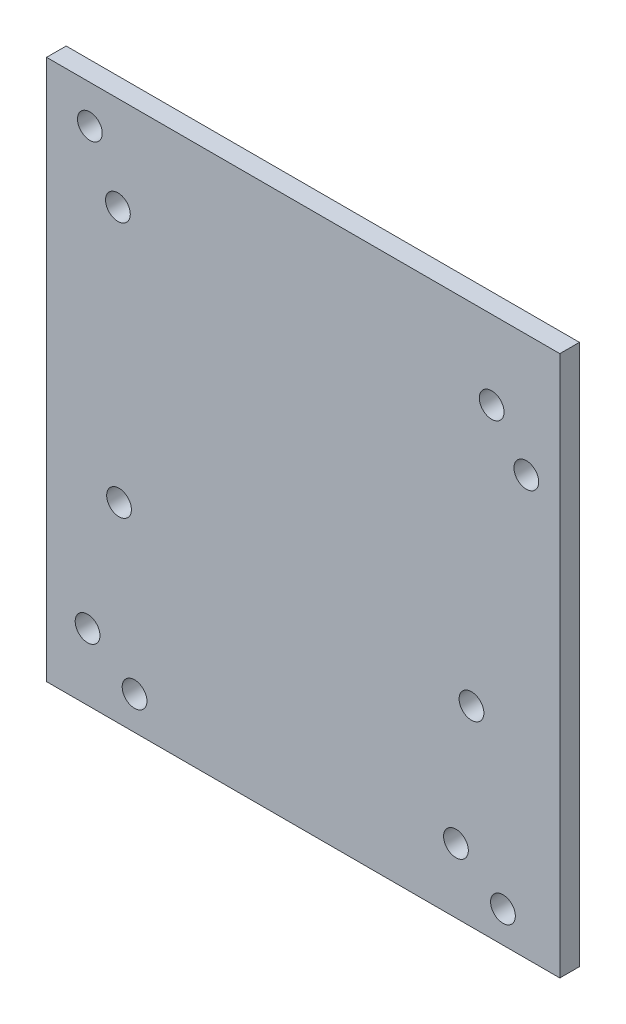
ISO-10303-21;
HEADER;
FILE_DESCRIPTION(('STEP AP214'),'2;1');
FILE_NAME('part.step','',(''),(''),'','','');
FILE_SCHEMA(('AUTOMOTIVE_DESIGN { 1 0 10303 214 1 1 1 1 }'));
ENDSEC;
DATA;
#1=APPLICATION_CONTEXT('core data for automotive mechanical design processes');
#2=APPLICATION_PROTOCOL_DEFINITION('international standard','automotive_design',2000,#1);
#3=PRODUCT_CONTEXT('',#1,'mechanical');
#4=PRODUCT('Part','Part','',(#3));
#5=PRODUCT_RELATED_PRODUCT_CATEGORY('part','',(#4));
#6=PRODUCT_DEFINITION_FORMATION('','',#4);
#7=PRODUCT_DEFINITION_CONTEXT('part definition',#1,'design');
#8=PRODUCT_DEFINITION('design','',#6,#7);
#9=PRODUCT_DEFINITION_SHAPE('','',#8);
#10=(LENGTH_UNIT() NAMED_UNIT(*) SI_UNIT(.MILLI.,.METRE.));
#11=(NAMED_UNIT(*) PLANE_ANGLE_UNIT() SI_UNIT($,.RADIAN.));
#12=(NAMED_UNIT(*) SI_UNIT($,.STERADIAN.) SOLID_ANGLE_UNIT());
#13=UNCERTAINTY_MEASURE_WITH_UNIT(LENGTH_MEASURE(1.E-05),#10,'distance_accuracy_value','');
#14=(GEOMETRIC_REPRESENTATION_CONTEXT(3) GLOBAL_UNCERTAINTY_ASSIGNED_CONTEXT((#13)) GLOBAL_UNIT_ASSIGNED_CONTEXT((#10,
#11,#12)) REPRESENTATION_CONTEXT('',''));
#15=CARTESIAN_POINT('',(0.,0.,0.));
#16=DIRECTION('',(0.,0.,1.));
#17=DIRECTION('',(1.,0.,0.));
#18=AXIS2_PLACEMENT_3D('',#15,#16,#17);
#19=CARTESIAN_POINT('',(0.,0.,-6.35));
#20=DIRECTION('',(0.,0.,1.));
#21=DIRECTION('',(-1.,0.,0.));
#22=AXIS2_PLACEMENT_3D('',#19,#20,#21);
#23=PLANE('',#22);
#24=DIRECTION('',(0.,1.,0.));
#25=VECTOR('',#24,1.);
#26=CARTESIAN_POINT('',(-529.711216697131,207.903265585856,-6.35));
#27=LINE('',#26,#25);
#28=CARTESIAN_POINT('',(-529.711216697131,207.903265585856,-6.35));
#29=VERTEX_POINT('',#28);
#30=CARTESIAN_POINT('',(-529.711216697131,383.2533201506,-6.35));
#31=VERTEX_POINT('',#30);
#32=EDGE_CURVE('E97',#29,#31,#27,.T.);
#33=ORIENTED_EDGE('',*,*,#32,.F.);
#34=DIRECTION('',(1.,0.,0.));
#35=VECTOR('',#34,1.);
#36=CARTESIAN_POINT('',(-696.157504886553,207.903265585856,-6.35));
#37=LINE('',#36,#35);
#38=CARTESIAN_POINT('',(-696.157504886553,207.903265585856,-6.35));
#39=VERTEX_POINT('',#38);
#40=EDGE_CURVE('E100',#39,#29,#37,.T.);
#41=ORIENTED_EDGE('',*,*,#40,.F.);
#42=DIRECTION('',(0.,-1.,0.));
#43=VECTOR('',#42,1.);
#44=CARTESIAN_POINT('',(-696.157504886553,207.903265585856,-6.35));
#45=LINE('',#44,#43);
#46=CARTESIAN_POINT('',(-696.157504886553,383.2533201506,-6.35));
#47=VERTEX_POINT('',#46);
#48=EDGE_CURVE('E88',#47,#39,#45,.T.);
#49=ORIENTED_EDGE('',*,*,#48,.F.);
#50=DIRECTION('',(-1.,0.,0.));
#51=VECTOR('',#50,1.);
#52=CARTESIAN_POINT('',(-696.157504886553,383.2533201506,-6.35));
#53=LINE('',#52,#51);
#54=EDGE_CURVE('E93',#31,#47,#53,.T.);
#55=ORIENTED_EDGE('',*,*,#54,.F.);
#56=EDGE_LOOP('',(#33,#41,#49,#55));
#57=FACE_BOUND('',#56,.T.);
#58=CARTESIAN_POINT('',(-667.625800723058,218.698265585856,-6.35));
#59=DIRECTION('',(0.,0.,1.));
#60=DIRECTION('',(1.,0.,0.));
#61=AXIS2_PLACEMENT_3D('',#58,#59,#60);
#62=CIRCLE('',#61,4.01269999999997);
#63=CARTESIAN_POINT('',(-663.613100723058,218.698265585856,-6.35));
#64=VERTEX_POINT('',#63);
#65=EDGE_CURVE('E109',#64,#64,#62,.T.);
#66=ORIENTED_EDGE('',*,*,#65,.T.);
#67=EDGE_LOOP('',(#66));
#68=FACE_BOUND('',#67,.T.);
#69=CARTESIAN_POINT('',(-682.865800723058,229.493265585856,-6.35));
#70=DIRECTION('',(0.,0.,1.));
#71=DIRECTION('',(1.,0.,0.));
#72=AXIS2_PLACEMENT_3D('',#69,#70,#71);
#73=CIRCLE('',#72,4.01269999999997);
#74=CARTESIAN_POINT('',(-678.853100723058,229.493265585856,-6.35));
#75=VERTEX_POINT('',#74);
#76=EDGE_CURVE('E120',#75,#75,#73,.T.);
#77=ORIENTED_EDGE('',*,*,#76,.T.);
#78=EDGE_LOOP('',(#77));
#79=FACE_BOUND('',#78,.T.);
#80=CARTESIAN_POINT('',(-682.121778023771,370.932816424034,-6.35));
#81=DIRECTION('',(0.,0.,1.));
#82=DIRECTION('',(1.,0.,0.));
#83=AXIS2_PLACEMENT_3D('',#80,#81,#82);
#84=CIRCLE('',#83,4.01270000000008);
#85=CARTESIAN_POINT('',(-678.109078023771,370.932816424034,-6.35));
#86=VERTEX_POINT('',#85);
#87=EDGE_CURVE('E126',#86,#86,#84,.T.);
#88=ORIENTED_EDGE('',*,*,#87,.T.);
#89=EDGE_LOOP('',(#88));
#90=FACE_BOUND('',#89,.T.);
#91=CARTESIAN_POINT('',(-673.025414387742,352.751458014907,-6.35));
#92=DIRECTION('',(0.,0.,1.));
#93=DIRECTION('',(1.,0.,0.));
#94=AXIS2_PLACEMENT_3D('',#91,#92,#93);
#95=CIRCLE('',#94,4.01270000000008);
#96=CARTESIAN_POINT('',(-669.012714387742,352.751458014907,-6.35));
#97=VERTEX_POINT('',#96);
#98=EDGE_CURVE('E132',#97,#97,#95,.T.);
#99=ORIENTED_EDGE('',*,*,#98,.T.);
#100=EDGE_LOOP('',(#99));
#101=FACE_BOUND('',#100,.T.);
#102=CARTESIAN_POINT('',(-551.816021725944,357.766762234083,-6.35));
#103=DIRECTION('',(0.,0.,1.));
#104=DIRECTION('',(1.,0.,0.));
#105=AXIS2_PLACEMENT_3D('',#102,#103,#104);
#106=CIRCLE('',#105,4.01270000000008);
#107=CARTESIAN_POINT('',(-547.803321725944,357.766762234083,-6.35));
#108=VERTEX_POINT('',#107);
#109=EDGE_CURVE('E138',#108,#108,#106,.T.);
#110=ORIENTED_EDGE('',*,*,#109,.T.);
#111=EDGE_LOOP('',(#110));
#112=FACE_BOUND('',#111,.T.);
#113=CARTESIAN_POINT('',(-540.572963717979,343.760561941729,-6.35));
#114=DIRECTION('',(0.,0.,1.));
#115=DIRECTION('',(1.,0.,0.));
#116=AXIS2_PLACEMENT_3D('',#113,#114,#115);
#117=CIRCLE('',#116,4.01270000000008);
#118=CARTESIAN_POINT('',(-536.560263717979,343.760561941729,-6.35));
#119=VERTEX_POINT('',#118);
#120=EDGE_CURVE('E144',#119,#119,#117,.T.);
#121=ORIENTED_EDGE('',*,*,#120,.T.);
#122=EDGE_LOOP('',(#121));
#123=FACE_BOUND('',#122,.T.);
#124=CARTESIAN_POINT('',(-548.156926739575,218.063265585856,-6.35));
#125=DIRECTION('',(0.,0.,1.));
#126=DIRECTION('',(1.,0.,0.));
#127=AXIS2_PLACEMENT_3D('',#124,#125,#126);
#128=CIRCLE('',#127,4.01270000000008);
#129=CARTESIAN_POINT('',(-544.144226739575,218.063265585856,-6.35));
#130=VERTEX_POINT('',#129);
#131=EDGE_CURVE('E150',#130,#130,#128,.T.);
#132=ORIENTED_EDGE('',*,*,#131,.T.);
#133=EDGE_LOOP('',(#132));
#134=FACE_BOUND('',#133,.T.);
#135=CARTESIAN_POINT('',(-563.396926739575,228.858265585856,-6.35));
#136=DIRECTION('',(0.,0.,1.));
#137=DIRECTION('',(1.,0.,0.));
#138=AXIS2_PLACEMENT_3D('',#135,#136,#137);
#139=CIRCLE('',#138,4.01270000000008);
#140=CARTESIAN_POINT('',(-559.384226739575,228.858265585856,-6.35));
#141=VERTEX_POINT('',#140);
#142=EDGE_CURVE('E156',#141,#141,#139,.T.);
#143=ORIENTED_EDGE('',*,*,#142,.T.);
#144=EDGE_LOOP('',(#143));
#145=FACE_BOUND('',#144,.T.);
#146=CARTESIAN_POINT('',(-558.361573731319,269.97258035059,-6.35));
#147=DIRECTION('',(0.,0.,1.));
#148=DIRECTION('',(1.,0.,0.));
#149=AXIS2_PLACEMENT_3D('',#146,#147,#148);
#150=CIRCLE('',#149,4.01320000000002);
#151=CARTESIAN_POINT('',(-554.348373731319,269.97258035059,-6.35));
#152=VERTEX_POINT('',#151);
#153=EDGE_CURVE('E162',#152,#152,#150,.T.);
#154=ORIENTED_EDGE('',*,*,#153,.T.);
#155=EDGE_LOOP('',(#154));
#156=FACE_BOUND('',#155,.T.);
#157=CARTESIAN_POINT('',(-672.661153731319,269.972580350589,-6.35));
#158=DIRECTION('',(0.,0.,1.));
#159=DIRECTION('',(1.,0.,0.));
#160=AXIS2_PLACEMENT_3D('',#157,#158,#159);
#161=CIRCLE('',#160,4.01320000000002);
#162=CARTESIAN_POINT('',(-668.647953731319,269.972580350589,-6.35));
#163=VERTEX_POINT('',#162);
#164=EDGE_CURVE('E168',#163,#163,#161,.T.);
#165=ORIENTED_EDGE('',*,*,#164,.T.);
#166=EDGE_LOOP('',(#165));
#167=FACE_BOUND('',#166,.T.);
#168=ADVANCED_FACE('F41',(#57,#68,#79,#90,#101,#112,#123,#134,#145,#156,#167),#23,.F.);
#169=CARTESIAN_POINT('',(0.,0.,0.));
#170=DIRECTION('',(0.,0.,1.));
#171=DIRECTION('',(-1.,0.,0.));
#172=AXIS2_PLACEMENT_3D('',#169,#170,#171);
#173=PLANE('',#172);
#174=CARTESIAN_POINT('',(-558.361573731319,269.97258035059,0.));
#175=DIRECTION('',(0.,0.,1.));
#176=DIRECTION('',(1.,0.,0.));
#177=AXIS2_PLACEMENT_3D('',#174,#175,#176);
#178=CIRCLE('',#177,4.01320000000002);
#179=CARTESIAN_POINT('',(-554.348373731319,269.97258035059,0.));
#180=VERTEX_POINT('',#179);
#181=EDGE_CURVE('E165',#180,#180,#178,.T.);
#182=ORIENTED_EDGE('',*,*,#181,.F.);
#183=EDGE_LOOP('',(#182));
#184=FACE_BOUND('',#183,.T.);
#185=CARTESIAN_POINT('',(-548.156926739575,218.063265585856,0.));
#186=DIRECTION('',(0.,0.,1.));
#187=DIRECTION('',(1.,0.,0.));
#188=AXIS2_PLACEMENT_3D('',#185,#186,#187);
#189=CIRCLE('',#188,4.01270000000008);
#190=CARTESIAN_POINT('',(-544.144226739575,218.063265585856,0.));
#191=VERTEX_POINT('',#190);
#192=EDGE_CURVE('E153',#191,#191,#189,.T.);
#193=ORIENTED_EDGE('',*,*,#192,.F.);
#194=EDGE_LOOP('',(#193));
#195=FACE_BOUND('',#194,.T.);
#196=CARTESIAN_POINT('',(-551.816021725944,357.766762234083,0.));
#197=DIRECTION('',(0.,0.,1.));
#198=DIRECTION('',(1.,0.,0.));
#199=AXIS2_PLACEMENT_3D('',#196,#197,#198);
#200=CIRCLE('',#199,4.01270000000008);
#201=CARTESIAN_POINT('',(-547.803321725944,357.766762234083,0.));
#202=VERTEX_POINT('',#201);
#203=EDGE_CURVE('E141',#202,#202,#200,.T.);
#204=ORIENTED_EDGE('',*,*,#203,.F.);
#205=EDGE_LOOP('',(#204));
#206=FACE_BOUND('',#205,.T.);
#207=CARTESIAN_POINT('',(-682.121778023771,370.932816424034,0.));
#208=DIRECTION('',(0.,0.,1.));
#209=DIRECTION('',(1.,0.,0.));
#210=AXIS2_PLACEMENT_3D('',#207,#208,#209);
#211=CIRCLE('',#210,4.01270000000008);
#212=CARTESIAN_POINT('',(-678.109078023771,370.932816424034,0.));
#213=VERTEX_POINT('',#212);
#214=EDGE_CURVE('E129',#213,#213,#211,.T.);
#215=ORIENTED_EDGE('',*,*,#214,.F.);
#216=EDGE_LOOP('',(#215));
#217=FACE_BOUND('',#216,.T.);
#218=CARTESIAN_POINT('',(-667.625800723058,218.698265585856,0.));
#219=DIRECTION('',(0.,0.,1.));
#220=DIRECTION('',(1.,0.,0.));
#221=AXIS2_PLACEMENT_3D('',#218,#219,#220);
#222=CIRCLE('',#221,4.01269999999997);
#223=CARTESIAN_POINT('',(-663.613100723058,218.698265585856,0.));
#224=VERTEX_POINT('',#223);
#225=EDGE_CURVE('E117',#224,#224,#222,.T.);
#226=ORIENTED_EDGE('',*,*,#225,.F.);
#227=EDGE_LOOP('',(#226));
#228=FACE_BOUND('',#227,.T.);
#229=DIRECTION('',(0.,1.,0.));
#230=VECTOR('',#229,1.);
#231=CARTESIAN_POINT('',(-529.711216697131,207.903265585856,0.));
#232=LINE('',#231,#230);
#233=CARTESIAN_POINT('',(-529.711216697131,207.903265585856,0.));
#234=VERTEX_POINT('',#233);
#235=CARTESIAN_POINT('',(-529.711216697131,383.2533201506,0.));
#236=VERTEX_POINT('',#235);
#237=EDGE_CURVE('E105',#234,#236,#232,.T.);
#238=ORIENTED_EDGE('',*,*,#237,.T.);
#239=DIRECTION('',(-1.,0.,0.));
#240=VECTOR('',#239,1.);
#241=CARTESIAN_POINT('',(-696.157504886553,383.2533201506,0.));
#242=LINE('',#241,#240);
#243=CARTESIAN_POINT('',(-696.157504886553,383.2533201506,0.));
#244=VERTEX_POINT('',#243);
#245=EDGE_CURVE('E108',#236,#244,#242,.T.);
#246=ORIENTED_EDGE('',*,*,#245,.T.);
#247=DIRECTION('',(0.,-1.,0.));
#248=VECTOR('',#247,1.);
#249=CARTESIAN_POINT('',(-696.157504886553,207.903265585856,0.));
#250=LINE('',#249,#248);
#251=CARTESIAN_POINT('',(-696.157504886553,207.903265585856,0.));
#252=VERTEX_POINT('',#251);
#253=EDGE_CURVE('E91',#244,#252,#250,.T.);
#254=ORIENTED_EDGE('',*,*,#253,.T.);
#255=DIRECTION('',(1.,0.,0.));
#256=VECTOR('',#255,1.);
#257=CARTESIAN_POINT('',(-696.157504886553,207.903265585856,0.));
#258=LINE('',#257,#256);
#259=EDGE_CURVE('E112',#252,#234,#258,.T.);
#260=ORIENTED_EDGE('',*,*,#259,.T.);
#261=EDGE_LOOP('',(#238,#246,#254,#260));
#262=FACE_BOUND('',#261,.T.);
#263=CARTESIAN_POINT('',(-682.865800723058,229.493265585856,0.));
#264=DIRECTION('',(0.,0.,1.));
#265=DIRECTION('',(1.,0.,0.));
#266=AXIS2_PLACEMENT_3D('',#263,#264,#265);
#267=CIRCLE('',#266,4.01269999999997);
#268=CARTESIAN_POINT('',(-678.853100723058,229.493265585856,0.));
#269=VERTEX_POINT('',#268);
#270=EDGE_CURVE('E123',#269,#269,#267,.T.);
#271=ORIENTED_EDGE('',*,*,#270,.F.);
#272=EDGE_LOOP('',(#271));
#273=FACE_BOUND('',#272,.T.);
#274=CARTESIAN_POINT('',(-673.025414387742,352.751458014907,0.));
#275=DIRECTION('',(0.,0.,1.));
#276=DIRECTION('',(1.,0.,0.));
#277=AXIS2_PLACEMENT_3D('',#274,#275,#276);
#278=CIRCLE('',#277,4.01270000000008);
#279=CARTESIAN_POINT('',(-669.012714387742,352.751458014907,0.));
#280=VERTEX_POINT('',#279);
#281=EDGE_CURVE('E135',#280,#280,#278,.T.);
#282=ORIENTED_EDGE('',*,*,#281,.F.);
#283=EDGE_LOOP('',(#282));
#284=FACE_BOUND('',#283,.T.);
#285=CARTESIAN_POINT('',(-540.572963717979,343.760561941729,0.));
#286=DIRECTION('',(0.,0.,1.));
#287=DIRECTION('',(1.,0.,0.));
#288=AXIS2_PLACEMENT_3D('',#285,#286,#287);
#289=CIRCLE('',#288,4.01270000000008);
#290=CARTESIAN_POINT('',(-536.560263717979,343.760561941729,0.));
#291=VERTEX_POINT('',#290);
#292=EDGE_CURVE('E147',#291,#291,#289,.T.);
#293=ORIENTED_EDGE('',*,*,#292,.F.);
#294=EDGE_LOOP('',(#293));
#295=FACE_BOUND('',#294,.T.);
#296=CARTESIAN_POINT('',(-563.396926739575,228.858265585856,0.));
#297=DIRECTION('',(0.,0.,1.));
#298=DIRECTION('',(1.,0.,0.));
#299=AXIS2_PLACEMENT_3D('',#296,#297,#298);
#300=CIRCLE('',#299,4.01270000000008);
#301=CARTESIAN_POINT('',(-559.384226739575,228.858265585856,0.));
#302=VERTEX_POINT('',#301);
#303=EDGE_CURVE('E159',#302,#302,#300,.T.);
#304=ORIENTED_EDGE('',*,*,#303,.F.);
#305=EDGE_LOOP('',(#304));
#306=FACE_BOUND('',#305,.T.);
#307=CARTESIAN_POINT('',(-672.661153731319,269.972580350589,0.));
#308=DIRECTION('',(0.,0.,1.));
#309=DIRECTION('',(1.,0.,0.));
#310=AXIS2_PLACEMENT_3D('',#307,#308,#309);
#311=CIRCLE('',#310,4.01320000000002);
#312=CARTESIAN_POINT('',(-668.647953731319,269.972580350589,0.));
#313=VERTEX_POINT('',#312);
#314=EDGE_CURVE('E171',#313,#313,#311,.T.);
#315=ORIENTED_EDGE('',*,*,#314,.F.);
#316=EDGE_LOOP('',(#315));
#317=FACE_BOUND('',#316,.T.);
#318=ADVANCED_FACE('F185',(#184,#195,#206,#217,#228,#262,#273,#284,#295,#306,#317),#173,.T.);
#319=CARTESIAN_POINT('',(-529.711216697131,207.903265585856,-6.35));
#320=DIRECTION('',(-1.,0.,0.));
#321=DIRECTION('',(0.,0.,-1.));
#322=AXIS2_PLACEMENT_3D('',#319,#320,#321);
#323=PLANE('',#322);
#324=ORIENTED_EDGE('',*,*,#237,.F.);
#325=DIRECTION('',(0.,0.,1.));
#326=VECTOR('',#325,1.);
#327=CARTESIAN_POINT('',(-529.711216697131,207.903265585856,-6.35));
#328=LINE('',#327,#326);
#329=EDGE_CURVE('E58',#29,#234,#328,.T.);
#330=ORIENTED_EDGE('',*,*,#329,.F.);
#331=ORIENTED_EDGE('',*,*,#32,.T.);
#332=DIRECTION('',(0.,0.,1.));
#333=VECTOR('',#332,1.);
#334=CARTESIAN_POINT('',(-529.711216697131,383.2533201506,-6.35));
#335=LINE('',#334,#333);
#336=EDGE_CURVE('E11',#31,#236,#335,.T.);
#337=ORIENTED_EDGE('',*,*,#336,.T.);
#338=EDGE_LOOP('',(#324,#330,#331,#337));
#339=FACE_BOUND('',#338,.T.);
#340=ADVANCED_FACE('F43',(#339),#323,.F.);
#341=CARTESIAN_POINT('',(-696.157504886553,383.2533201506,-6.35));
#342=DIRECTION('',(0.,-1.,0.));
#343=DIRECTION('',(0.,0.,1.));
#344=AXIS2_PLACEMENT_3D('',#341,#342,#343);
#345=PLANE('',#344);
#346=ORIENTED_EDGE('',*,*,#245,.F.);
#347=ORIENTED_EDGE('',*,*,#336,.F.);
#348=ORIENTED_EDGE('',*,*,#54,.T.);
#349=DIRECTION('',(0.,0.,1.));
#350=VECTOR('',#349,1.);
#351=CARTESIAN_POINT('',(-696.157504886553,383.2533201506,-6.35));
#352=LINE('',#351,#350);
#353=EDGE_CURVE('E50',#47,#244,#352,.T.);
#354=ORIENTED_EDGE('',*,*,#353,.T.);
#355=EDGE_LOOP('',(#346,#347,#348,#354));
#356=FACE_BOUND('',#355,.T.);
#357=ADVANCED_FACE('F94',(#356),#345,.F.);
#358=CARTESIAN_POINT('',(-696.157504886553,207.903265585856,-6.35));
#359=DIRECTION('',(1.,0.,0.));
#360=DIRECTION('',(0.,0.,1.));
#361=AXIS2_PLACEMENT_3D('',#358,#359,#360);
#362=PLANE('',#361);
#363=ORIENTED_EDGE('',*,*,#253,.F.);
#364=ORIENTED_EDGE('',*,*,#353,.F.);
#365=ORIENTED_EDGE('',*,*,#48,.T.);
#366=DIRECTION('',(0.,0.,1.));
#367=VECTOR('',#366,1.);
#368=CARTESIAN_POINT('',(-696.157504886553,207.903265585856,-6.35));
#369=LINE('',#368,#367);
#370=EDGE_CURVE('E74',#39,#252,#369,.T.);
#371=ORIENTED_EDGE('',*,*,#370,.T.);
#372=EDGE_LOOP('',(#363,#364,#365,#371));
#373=FACE_BOUND('',#372,.T.);
#374=ADVANCED_FACE('F86',(#373),#362,.F.);
#375=CARTESIAN_POINT('',(-696.157504886553,207.903265585856,-6.35));
#376=DIRECTION('',(0.,1.,0.));
#377=DIRECTION('',(0.,0.,-1.));
#378=AXIS2_PLACEMENT_3D('',#375,#376,#377);
#379=PLANE('',#378);
#380=ORIENTED_EDGE('',*,*,#259,.F.);
#381=ORIENTED_EDGE('',*,*,#370,.F.);
#382=ORIENTED_EDGE('',*,*,#40,.T.);
#383=ORIENTED_EDGE('',*,*,#329,.T.);
#384=EDGE_LOOP('',(#380,#381,#382,#383));
#385=FACE_BOUND('',#384,.T.);
#386=ADVANCED_FACE('F198',(#385),#379,.F.);
#387=CARTESIAN_POINT('',(-667.625800723058,218.698265585856,-6.35));
#388=DIRECTION('',(0.,0.,1.));
#389=DIRECTION('',(-1.,0.,0.));
#390=AXIS2_PLACEMENT_3D('',#387,#388,#389);
#391=CYLINDRICAL_SURFACE('',#390,4.01269999999997);
#392=ORIENTED_EDGE('',*,*,#65,.F.);
#393=EDGE_LOOP('',(#392));
#394=FACE_BOUND('',#393,.T.);
#395=ORIENTED_EDGE('',*,*,#225,.T.);
#396=EDGE_LOOP('',(#395));
#397=FACE_BOUND('',#396,.T.);
#398=ADVANCED_FACE('F201',(#394,#397),#391,.F.);
#399=CARTESIAN_POINT('',(-682.865800723058,229.493265585856,-6.35));
#400=DIRECTION('',(0.,0.,1.));
#401=DIRECTION('',(-1.,0.,0.));
#402=AXIS2_PLACEMENT_3D('',#399,#400,#401);
#403=CYLINDRICAL_SURFACE('',#402,4.01269999999997);
#404=ORIENTED_EDGE('',*,*,#76,.F.);
#405=EDGE_LOOP('',(#404));
#406=FACE_BOUND('',#405,.T.);
#407=ORIENTED_EDGE('',*,*,#270,.T.);
#408=EDGE_LOOP('',(#407));
#409=FACE_BOUND('',#408,.T.);
#410=ADVANCED_FACE('F225',(#406,#409),#403,.F.);
#411=CARTESIAN_POINT('',(-682.121778023771,370.932816424034,-6.35));
#412=DIRECTION('',(0.,0.,1.));
#413=DIRECTION('',(-1.,0.,0.));
#414=AXIS2_PLACEMENT_3D('',#411,#412,#413);
#415=CYLINDRICAL_SURFACE('',#414,4.01270000000008);
#416=ORIENTED_EDGE('',*,*,#87,.F.);
#417=EDGE_LOOP('',(#416));
#418=FACE_BOUND('',#417,.T.);
#419=ORIENTED_EDGE('',*,*,#214,.T.);
#420=EDGE_LOOP('',(#419));
#421=FACE_BOUND('',#420,.T.);
#422=ADVANCED_FACE('F233',(#418,#421),#415,.F.);
#423=CARTESIAN_POINT('',(-673.025414387742,352.751458014907,-6.35));
#424=DIRECTION('',(0.,0.,1.));
#425=DIRECTION('',(-1.,0.,0.));
#426=AXIS2_PLACEMENT_3D('',#423,#424,#425);
#427=CYLINDRICAL_SURFACE('',#426,4.01270000000008);
#428=ORIENTED_EDGE('',*,*,#98,.F.);
#429=EDGE_LOOP('',(#428));
#430=FACE_BOUND('',#429,.T.);
#431=ORIENTED_EDGE('',*,*,#281,.T.);
#432=EDGE_LOOP('',(#431));
#433=FACE_BOUND('',#432,.T.);
#434=ADVANCED_FACE('F242',(#430,#433),#427,.F.);
#435=CARTESIAN_POINT('',(-551.816021725944,357.766762234083,-6.35));
#436=DIRECTION('',(0.,0.,1.));
#437=DIRECTION('',(-1.,0.,0.));
#438=AXIS2_PLACEMENT_3D('',#435,#436,#437);
#439=CYLINDRICAL_SURFACE('',#438,4.01270000000008);
#440=ORIENTED_EDGE('',*,*,#109,.F.);
#441=EDGE_LOOP('',(#440));
#442=FACE_BOUND('',#441,.T.);
#443=ORIENTED_EDGE('',*,*,#203,.T.);
#444=EDGE_LOOP('',(#443));
#445=FACE_BOUND('',#444,.T.);
#446=ADVANCED_FACE('F251',(#442,#445),#439,.F.);
#447=CARTESIAN_POINT('',(-540.572963717979,343.760561941729,-6.35));
#448=DIRECTION('',(0.,0.,1.));
#449=DIRECTION('',(-1.,0.,0.));
#450=AXIS2_PLACEMENT_3D('',#447,#448,#449);
#451=CYLINDRICAL_SURFACE('',#450,4.01270000000008);
#452=ORIENTED_EDGE('',*,*,#120,.F.);
#453=EDGE_LOOP('',(#452));
#454=FACE_BOUND('',#453,.T.);
#455=ORIENTED_EDGE('',*,*,#292,.T.);
#456=EDGE_LOOP('',(#455));
#457=FACE_BOUND('',#456,.T.);
#458=ADVANCED_FACE('F260',(#454,#457),#451,.F.);
#459=CARTESIAN_POINT('',(-548.156926739575,218.063265585856,-6.35));
#460=DIRECTION('',(0.,0.,1.));
#461=DIRECTION('',(-1.,0.,0.));
#462=AXIS2_PLACEMENT_3D('',#459,#460,#461);
#463=CYLINDRICAL_SURFACE('',#462,4.01270000000008);
#464=ORIENTED_EDGE('',*,*,#131,.F.);
#465=EDGE_LOOP('',(#464));
#466=FACE_BOUND('',#465,.T.);
#467=ORIENTED_EDGE('',*,*,#192,.T.);
#468=EDGE_LOOP('',(#467));
#469=FACE_BOUND('',#468,.T.);
#470=ADVANCED_FACE('F269',(#466,#469),#463,.F.);
#471=CARTESIAN_POINT('',(-563.396926739575,228.858265585856,-6.35));
#472=DIRECTION('',(0.,0.,1.));
#473=DIRECTION('',(-1.,0.,0.));
#474=AXIS2_PLACEMENT_3D('',#471,#472,#473);
#475=CYLINDRICAL_SURFACE('',#474,4.01270000000008);
#476=ORIENTED_EDGE('',*,*,#142,.F.);
#477=EDGE_LOOP('',(#476));
#478=FACE_BOUND('',#477,.T.);
#479=ORIENTED_EDGE('',*,*,#303,.T.);
#480=EDGE_LOOP('',(#479));
#481=FACE_BOUND('',#480,.T.);
#482=ADVANCED_FACE('F278',(#478,#481),#475,.F.);
#483=CARTESIAN_POINT('',(-558.361573731319,269.97258035059,-6.35));
#484=DIRECTION('',(0.,0.,1.));
#485=DIRECTION('',(-1.,0.,0.));
#486=AXIS2_PLACEMENT_3D('',#483,#484,#485);
#487=CYLINDRICAL_SURFACE('',#486,4.01320000000002);
#488=ORIENTED_EDGE('',*,*,#153,.F.);
#489=EDGE_LOOP('',(#488));
#490=FACE_BOUND('',#489,.T.);
#491=ORIENTED_EDGE('',*,*,#181,.T.);
#492=EDGE_LOOP('',(#491));
#493=FACE_BOUND('',#492,.T.);
#494=ADVANCED_FACE('F181',(#490,#493),#487,.F.);
#495=CARTESIAN_POINT('',(-672.661153731319,269.972580350589,-6.35));
#496=DIRECTION('',(0.,0.,1.));
#497=DIRECTION('',(-1.,0.,0.));
#498=AXIS2_PLACEMENT_3D('',#495,#496,#497);
#499=CYLINDRICAL_SURFACE('',#498,4.01320000000002);
#500=ORIENTED_EDGE('',*,*,#164,.F.);
#501=EDGE_LOOP('',(#500));
#502=FACE_BOUND('',#501,.T.);
#503=ORIENTED_EDGE('',*,*,#314,.T.);
#504=EDGE_LOOP('',(#503));
#505=FACE_BOUND('',#504,.T.);
#506=ADVANCED_FACE('F178',(#502,#505),#499,.F.);
#507=CLOSED_SHELL('',(#168,#318,#340,#357,#374,#386,#398,#410,#422,#434,#446,#458,#470,#482,
#494,#506));
#508=MANIFOLD_SOLID_BREP('B2',#507);
#509=ADVANCED_BREP_SHAPE_REPRESENTATION('',(#18,#508),#14);
#510=SHAPE_DEFINITION_REPRESENTATION(#9,#509);
ENDSEC;
END-ISO-10303-21;
